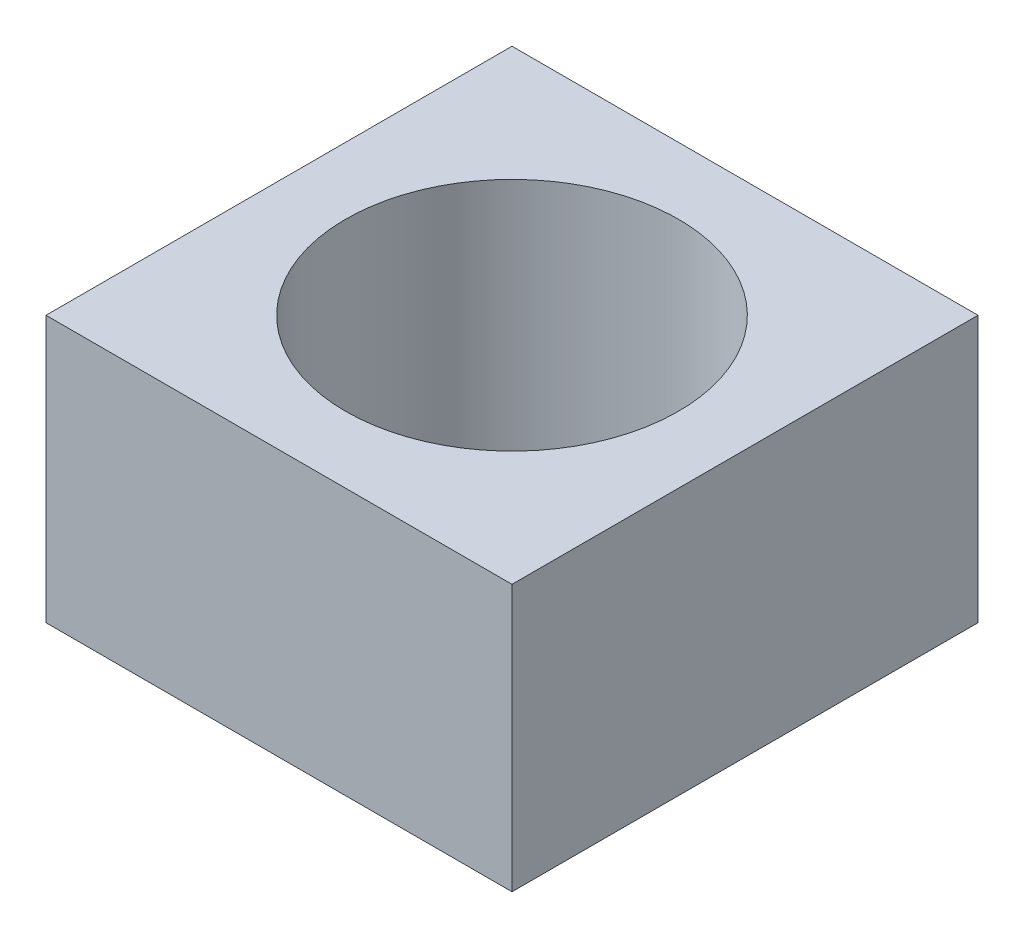
ISO-10303-21;
HEADER;
FILE_DESCRIPTION(('STEP AP214'),'2;1');
FILE_NAME('part.step','',(''),(''),'','','');
FILE_SCHEMA(('AUTOMOTIVE_DESIGN { 1 0 10303 214 1 1 1 1 }'));
ENDSEC;
DATA;
#1=APPLICATION_CONTEXT('core data for automotive mechanical design processes');
#2=APPLICATION_PROTOCOL_DEFINITION('international standard','automotive_design',2000,#1);
#3=PRODUCT_CONTEXT('',#1,'mechanical');
#4=PRODUCT('Part','Part','',(#3));
#5=PRODUCT_RELATED_PRODUCT_CATEGORY('part','',(#4));
#6=PRODUCT_DEFINITION_FORMATION('','',#4);
#7=PRODUCT_DEFINITION_CONTEXT('part definition',#1,'design');
#8=PRODUCT_DEFINITION('design','',#6,#7);
#9=PRODUCT_DEFINITION_SHAPE('','',#8);
#10=(LENGTH_UNIT() NAMED_UNIT(*) SI_UNIT(.MILLI.,.METRE.));
#11=(NAMED_UNIT(*) PLANE_ANGLE_UNIT() SI_UNIT($,.RADIAN.));
#12=(NAMED_UNIT(*) SI_UNIT($,.STERADIAN.) SOLID_ANGLE_UNIT());
#13=UNCERTAINTY_MEASURE_WITH_UNIT(LENGTH_MEASURE(1.E-05),#10,'distance_accuracy_value','');
#14=(GEOMETRIC_REPRESENTATION_CONTEXT(3) GLOBAL_UNCERTAINTY_ASSIGNED_CONTEXT((#13)) GLOBAL_UNIT_ASSIGNED_CONTEXT((#10,
#11,#12)) REPRESENTATION_CONTEXT('',''));
#15=CARTESIAN_POINT('',(0.,0.,0.));
#16=DIRECTION('',(0.,0.,1.));
#17=DIRECTION('',(1.,0.,0.));
#18=AXIS2_PLACEMENT_3D('',#15,#16,#17);
#19=CARTESIAN_POINT('',(0.,4.,0.));
#20=DIRECTION('',(0.,-1.,0.));
#21=DIRECTION('',(0.,0.,-1.));
#22=AXIS2_PLACEMENT_3D('',#19,#20,#21);
#23=PLANE('',#22);
#24=DIRECTION('',(0.,0.,1.));
#25=VECTOR('',#24,1.);
#26=CARTESIAN_POINT('',(0.,4.,0.));
#27=LINE('',#26,#25);
#28=CARTESIAN_POINT('',(0.,4.,-7.));
#29=VERTEX_POINT('',#28);
#30=CARTESIAN_POINT('',(0.,4.,0.));
#31=VERTEX_POINT('',#30);
#32=EDGE_CURVE('E93',#29,#31,#27,.T.);
#33=ORIENTED_EDGE('',*,*,#32,.T.);
#34=DIRECTION('',(1.,0.,0.));
#35=VECTOR('',#34,1.);
#36=CARTESIAN_POINT('',(0.,4.,0.));
#37=LINE('',#36,#35);
#38=CARTESIAN_POINT('',(7.,4.,0.));
#39=VERTEX_POINT('',#38);
#40=EDGE_CURVE('E88',#31,#39,#37,.T.);
#41=ORIENTED_EDGE('',*,*,#40,.T.);
#42=DIRECTION('',(0.,0.,-1.));
#43=VECTOR('',#42,1.);
#44=CARTESIAN_POINT('',(7.,4.,0.));
#45=LINE('',#44,#43);
#46=CARTESIAN_POINT('',(7.,4.,-7.));
#47=VERTEX_POINT('',#46);
#48=EDGE_CURVE('E91',#39,#47,#45,.T.);
#49=ORIENTED_EDGE('',*,*,#48,.T.);
#50=DIRECTION('',(-1.,0.,0.));
#51=VECTOR('',#50,1.);
#52=CARTESIAN_POINT('',(0.,4.,-7.));
#53=LINE('',#52,#51);
#54=EDGE_CURVE('E58',#47,#29,#53,.T.);
#55=ORIENTED_EDGE('',*,*,#54,.T.);
#56=EDGE_LOOP('',(#33,#41,#49,#55));
#57=FACE_BOUND('',#56,.T.);
#58=CARTESIAN_POINT('',(3.5,4.,-3.5));
#59=DIRECTION('',(0.,1.,0.));
#60=DIRECTION('',(0.,0.,1.));
#61=AXIS2_PLACEMENT_3D('',#58,#59,#60);
#62=CIRCLE('',#61,2.5);
#63=CARTESIAN_POINT('',(3.5,4.,-1.));
#64=VERTEX_POINT('',#63);
#65=EDGE_CURVE('E108',#64,#64,#62,.T.);
#66=ORIENTED_EDGE('',*,*,#65,.F.);
#67=EDGE_LOOP('',(#66));
#68=FACE_BOUND('',#67,.T.);
#69=ADVANCED_FACE('F41',(#57,#68),#23,.F.);
#70=CARTESIAN_POINT('',(0.,0.,0.));
#71=DIRECTION('',(0.,-1.,0.));
#72=DIRECTION('',(0.,0.,-1.));
#73=AXIS2_PLACEMENT_3D('',#70,#71,#72);
#74=PLANE('',#73);
#75=DIRECTION('',(0.,0.,1.));
#76=VECTOR('',#75,1.);
#77=CARTESIAN_POINT('',(0.,0.,0.));
#78=LINE('',#77,#76);
#79=CARTESIAN_POINT('',(0.,0.,-7.));
#80=VERTEX_POINT('',#79);
#81=CARTESIAN_POINT('',(0.,0.,0.));
#82=VERTEX_POINT('',#81);
#83=EDGE_CURVE('E105',#80,#82,#78,.T.);
#84=ORIENTED_EDGE('',*,*,#83,.F.);
#85=DIRECTION('',(-1.,0.,0.));
#86=VECTOR('',#85,1.);
#87=CARTESIAN_POINT('',(0.,0.,-7.));
#88=LINE('',#87,#86);
#89=CARTESIAN_POINT('',(7.,0.,-7.));
#90=VERTEX_POINT('',#89);
#91=EDGE_CURVE('E81',#90,#80,#88,.T.);
#92=ORIENTED_EDGE('',*,*,#91,.F.);
#93=DIRECTION('',(0.,0.,-1.));
#94=VECTOR('',#93,1.);
#95=CARTESIAN_POINT('',(7.,0.,0.));
#96=LINE('',#95,#94);
#97=CARTESIAN_POINT('',(7.,0.,0.));
#98=VERTEX_POINT('',#97);
#99=EDGE_CURVE('E75',#98,#90,#96,.T.);
#100=ORIENTED_EDGE('',*,*,#99,.F.);
#101=DIRECTION('',(1.,0.,0.));
#102=VECTOR('',#101,1.);
#103=CARTESIAN_POINT('',(0.,0.,0.));
#104=LINE('',#103,#102);
#105=EDGE_CURVE('E97',#82,#98,#104,.T.);
#106=ORIENTED_EDGE('',*,*,#105,.F.);
#107=EDGE_LOOP('',(#84,#92,#100,#106));
#108=FACE_BOUND('',#107,.T.);
#109=CARTESIAN_POINT('',(3.5,0.,-3.5));
#110=DIRECTION('',(0.,1.,0.));
#111=DIRECTION('',(0.,0.,1.));
#112=AXIS2_PLACEMENT_3D('',#109,#110,#111);
#113=CIRCLE('',#112,2.5);
#114=CARTESIAN_POINT('',(3.5,0.,-1.));
#115=VERTEX_POINT('',#114);
#116=EDGE_CURVE('E120',#115,#115,#113,.T.);
#117=ORIENTED_EDGE('',*,*,#116,.T.);
#118=EDGE_LOOP('',(#117));
#119=FACE_BOUND('',#118,.T.);
#120=ADVANCED_FACE('F116',(#108,#119),#74,.T.);
#121=CARTESIAN_POINT('',(0.,4.,0.));
#122=DIRECTION('',(1.,0.,0.));
#123=DIRECTION('',(0.,0.,-1.));
#124=AXIS2_PLACEMENT_3D('',#121,#122,#123);
#125=PLANE('',#124);
#126=ORIENTED_EDGE('',*,*,#83,.T.);
#127=DIRECTION('',(0.,-1.,0.));
#128=VECTOR('',#127,1.);
#129=CARTESIAN_POINT('',(0.,4.,0.));
#130=LINE('',#129,#128);
#131=EDGE_CURVE('E11',#31,#82,#130,.T.);
#132=ORIENTED_EDGE('',*,*,#131,.F.);
#133=ORIENTED_EDGE('',*,*,#32,.F.);
#134=DIRECTION('',(0.,-1.,0.));
#135=VECTOR('',#134,1.);
#136=CARTESIAN_POINT('',(0.,4.,-7.));
#137=LINE('',#136,#135);
#138=EDGE_CURVE('E101',#29,#80,#137,.T.);
#139=ORIENTED_EDGE('',*,*,#138,.T.);
#140=EDGE_LOOP('',(#126,#132,#133,#139));
#141=FACE_BOUND('',#140,.T.);
#142=ADVANCED_FACE('F43',(#141),#125,.F.);
#143=CARTESIAN_POINT('',(0.,4.,0.));
#144=DIRECTION('',(0.,0.,-1.));
#145=DIRECTION('',(-1.,0.,0.));
#146=AXIS2_PLACEMENT_3D('',#143,#144,#145);
#147=PLANE('',#146);
#148=ORIENTED_EDGE('',*,*,#105,.T.);
#149=DIRECTION('',(0.,-1.,0.));
#150=VECTOR('',#149,1.);
#151=CARTESIAN_POINT('',(7.,4.,0.));
#152=LINE('',#151,#150);
#153=EDGE_CURVE('E50',#39,#98,#152,.T.);
#154=ORIENTED_EDGE('',*,*,#153,.F.);
#155=ORIENTED_EDGE('',*,*,#40,.F.);
#156=ORIENTED_EDGE('',*,*,#131,.T.);
#157=EDGE_LOOP('',(#148,#154,#155,#156));
#158=FACE_BOUND('',#157,.T.);
#159=ADVANCED_FACE('F96',(#158),#147,.F.);
#160=CARTESIAN_POINT('',(7.,4.,0.));
#161=DIRECTION('',(-1.,0.,0.));
#162=DIRECTION('',(0.,0.,1.));
#163=AXIS2_PLACEMENT_3D('',#160,#161,#162);
#164=PLANE('',#163);
#165=ORIENTED_EDGE('',*,*,#99,.T.);
#166=DIRECTION('',(0.,-1.,0.));
#167=VECTOR('',#166,1.);
#168=CARTESIAN_POINT('',(7.,4.,-7.));
#169=LINE('',#168,#167);
#170=EDGE_CURVE('E98',#47,#90,#169,.T.);
#171=ORIENTED_EDGE('',*,*,#170,.F.);
#172=ORIENTED_EDGE('',*,*,#48,.F.);
#173=ORIENTED_EDGE('',*,*,#153,.T.);
#174=EDGE_LOOP('',(#165,#171,#172,#173));
#175=FACE_BOUND('',#174,.T.);
#176=ADVANCED_FACE('F99',(#175),#164,.F.);
#177=CARTESIAN_POINT('',(0.,4.,-7.));
#178=DIRECTION('',(0.,0.,1.));
#179=DIRECTION('',(1.,0.,0.));
#180=AXIS2_PLACEMENT_3D('',#177,#178,#179);
#181=PLANE('',#180);
#182=ORIENTED_EDGE('',*,*,#91,.T.);
#183=ORIENTED_EDGE('',*,*,#138,.F.);
#184=ORIENTED_EDGE('',*,*,#54,.F.);
#185=ORIENTED_EDGE('',*,*,#170,.T.);
#186=EDGE_LOOP('',(#182,#183,#184,#185));
#187=FACE_BOUND('',#186,.T.);
#188=ADVANCED_FACE('F113',(#187),#181,.F.);
#189=CARTESIAN_POINT('',(3.5,4.,-3.5));
#190=DIRECTION('',(0.,-1.,0.));
#191=DIRECTION('',(0.,0.,-1.));
#192=AXIS2_PLACEMENT_3D('',#189,#190,#191);
#193=CYLINDRICAL_SURFACE('',#192,2.5);
#194=ORIENTED_EDGE('',*,*,#65,.T.);
#195=EDGE_LOOP('',(#194));
#196=FACE_BOUND('',#195,.T.);
#197=ORIENTED_EDGE('',*,*,#116,.F.);
#198=EDGE_LOOP('',(#197));
#199=FACE_BOUND('',#198,.T.);
#200=ADVANCED_FACE('F126',(#196,#199),#193,.F.);
#201=CLOSED_SHELL('',(#69,#120,#142,#159,#176,#188,#200));
#202=MANIFOLD_SOLID_BREP('B2',#201);
#203=ADVANCED_BREP_SHAPE_REPRESENTATION('',(#18,#202),#14);
#204=SHAPE_DEFINITION_REPRESENTATION(#9,#203);
ENDSEC;
END-ISO-10303-21;
